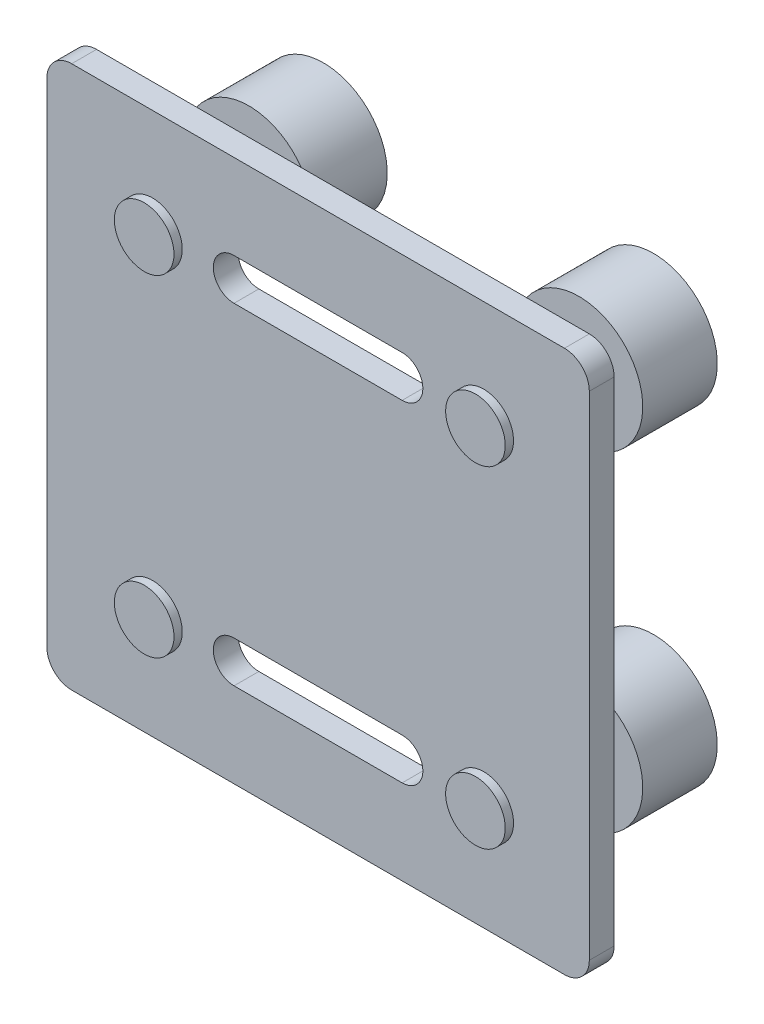
ISO-10303-21;
HEADER;
FILE_DESCRIPTION(('STEP AP214'),'2;1');
FILE_NAME('part.step','',(''),(''),'','','');
FILE_SCHEMA(('AUTOMOTIVE_DESIGN { 1 0 10303 214 1 1 1 1 }'));
ENDSEC;
DATA;
#1=APPLICATION_CONTEXT('core data for automotive mechanical design processes');
#2=APPLICATION_PROTOCOL_DEFINITION('international standard','automotive_design',2000,#1);
#3=PRODUCT_CONTEXT('',#1,'mechanical');
#4=PRODUCT('Part','Part','',(#3));
#5=PRODUCT_RELATED_PRODUCT_CATEGORY('part','',(#4));
#6=PRODUCT_DEFINITION_FORMATION('','',#4);
#7=PRODUCT_DEFINITION_CONTEXT('part definition',#1,'design');
#8=PRODUCT_DEFINITION('design','',#6,#7);
#9=PRODUCT_DEFINITION_SHAPE('','',#8);
#10=(LENGTH_UNIT() NAMED_UNIT(*) SI_UNIT(.MILLI.,.METRE.));
#11=(NAMED_UNIT(*) PLANE_ANGLE_UNIT() SI_UNIT($,.RADIAN.));
#12=(NAMED_UNIT(*) SI_UNIT($,.STERADIAN.) SOLID_ANGLE_UNIT());
#13=UNCERTAINTY_MEASURE_WITH_UNIT(LENGTH_MEASURE(1.E-05),#10,'distance_accuracy_value','');
#14=(GEOMETRIC_REPRESENTATION_CONTEXT(3) GLOBAL_UNCERTAINTY_ASSIGNED_CONTEXT((#13)) GLOBAL_UNIT_ASSIGNED_CONTEXT((#10,
#11,#12)) REPRESENTATION_CONTEXT('',''));
#15=CARTESIAN_POINT('',(0.,0.,0.));
#16=DIRECTION('',(0.,0.,1.));
#17=DIRECTION('',(1.,0.,0.));
#18=AXIS2_PLACEMENT_3D('',#15,#16,#17);
#19=CARTESIAN_POINT('',(0.,0.,3.));
#20=DIRECTION('',(0.,0.,1.));
#21=DIRECTION('',(1.,0.,0.));
#22=AXIS2_PLACEMENT_3D('',#19,#20,#21);
#23=PLANE('',#22);
#24=DIRECTION('',(-1.,0.,0.));
#25=VECTOR('',#24,1.);
#26=CARTESIAN_POINT('',(-10.15,-17.5,3.));
#27=LINE('',#26,#25);
#28=CARTESIAN_POINT('',(10.15,-17.5,3.));
#29=VERTEX_POINT('',#28);
#30=CARTESIAN_POINT('',(-10.15,-17.5,3.));
#31=VERTEX_POINT('',#30);
#32=EDGE_CURVE('E164',#29,#31,#27,.T.);
#33=ORIENTED_EDGE('',*,*,#32,.F.);
#34=CARTESIAN_POINT('',(10.15,-20.,3.));
#35=DIRECTION('',(0.,0.,1.));
#36=DIRECTION('',(1.,0.,0.));
#37=AXIS2_PLACEMENT_3D('',#34,#35,#36);
#38=CIRCLE('',#37,2.5);
#39=CARTESIAN_POINT('',(10.15,-22.5,3.));
#40=VERTEX_POINT('',#39);
#41=EDGE_CURVE('E154',#40,#29,#38,.T.);
#42=ORIENTED_EDGE('',*,*,#41,.F.);
#43=DIRECTION('',(1.,0.,0.));
#44=VECTOR('',#43,1.);
#45=CARTESIAN_POINT('',(-10.15,-22.5,3.));
#46=LINE('',#45,#44);
#47=CARTESIAN_POINT('',(-10.15,-22.5,3.));
#48=VERTEX_POINT('',#47);
#49=EDGE_CURVE('E180',#48,#40,#46,.T.);
#50=ORIENTED_EDGE('',*,*,#49,.F.);
#51=CARTESIAN_POINT('',(-10.15,-20.,3.));
#52=DIRECTION('',(0.,0.,1.));
#53=DIRECTION('',(-1.,0.,0.));
#54=AXIS2_PLACEMENT_3D('',#51,#52,#53);
#55=CIRCLE('',#54,2.5);
#56=EDGE_CURVE('E178',#31,#48,#55,.T.);
#57=ORIENTED_EDGE('',*,*,#56,.F.);
#58=EDGE_LOOP('',(#33,#42,#50,#57));
#59=FACE_BOUND('',#58,.T.);
#60=CARTESIAN_POINT('',(20.,-20.,3.));
#61=DIRECTION('',(0.,0.,1.));
#62=DIRECTION('',(1.,0.,0.));
#63=AXIS2_PLACEMENT_3D('',#60,#61,#62);
#64=CIRCLE('',#63,3.6);
#65=CARTESIAN_POINT('',(23.6,-20.,3.));
#66=VERTEX_POINT('',#65);
#67=EDGE_CURVE('E172',#66,#66,#64,.T.);
#68=ORIENTED_EDGE('',*,*,#67,.F.);
#69=EDGE_LOOP('',(#68));
#70=FACE_BOUND('',#69,.T.);
#71=CARTESIAN_POINT('',(-20.,20.,3.));
#72=DIRECTION('',(0.,0.,1.));
#73=DIRECTION('',(1.,0.,0.));
#74=AXIS2_PLACEMENT_3D('',#71,#72,#73);
#75=CIRCLE('',#74,3.6);
#76=CARTESIAN_POINT('',(-16.4,20.,3.));
#77=VERTEX_POINT('',#76);
#78=EDGE_CURVE('E234',#77,#77,#75,.T.);
#79=ORIENTED_EDGE('',*,*,#78,.F.);
#80=EDGE_LOOP('',(#79));
#81=FACE_BOUND('',#80,.T.);
#82=DIRECTION('',(0.,-1.,0.));
#83=VECTOR('',#82,1.);
#84=CARTESIAN_POINT('',(-32.75,-32.75,3.));
#85=LINE('',#84,#83);
#86=CARTESIAN_POINT('',(-32.75,29.75,3.));
#87=VERTEX_POINT('',#86);
#88=CARTESIAN_POINT('',(-32.75,-29.75,3.));
#89=VERTEX_POINT('',#88);
#90=EDGE_CURVE('E238',#87,#89,#85,.T.);
#91=ORIENTED_EDGE('',*,*,#90,.T.);
#92=CARTESIAN_POINT('',(-29.75,-29.75,3.));
#93=DIRECTION('',(0.,0.,1.));
#94=DIRECTION('',(1.,0.,0.));
#95=AXIS2_PLACEMENT_3D('',#92,#93,#94);
#96=CIRCLE('',#95,3.);
#97=CARTESIAN_POINT('',(-29.75,-32.75,3.));
#98=VERTEX_POINT('',#97);
#99=EDGE_CURVE('E281',#89,#98,#96,.T.);
#100=ORIENTED_EDGE('',*,*,#99,.T.);
#101=DIRECTION('',(1.,0.,0.));
#102=VECTOR('',#101,1.);
#103=CARTESIAN_POINT('',(32.75,-32.75,3.));
#104=LINE('',#103,#102);
#105=CARTESIAN_POINT('',(29.75,-32.75,3.));
#106=VERTEX_POINT('',#105);
#107=EDGE_CURVE('E241',#98,#106,#104,.T.);
#108=ORIENTED_EDGE('',*,*,#107,.T.);
#109=CARTESIAN_POINT('',(29.75,-29.75,3.));
#110=DIRECTION('',(0.,0.,1.));
#111=DIRECTION('',(1.,0.,0.));
#112=AXIS2_PLACEMENT_3D('',#109,#110,#111);
#113=CIRCLE('',#112,3.);
#114=CARTESIAN_POINT('',(32.75,-29.75,3.));
#115=VERTEX_POINT('',#114);
#116=EDGE_CURVE('E279',#106,#115,#113,.T.);
#117=ORIENTED_EDGE('',*,*,#116,.T.);
#118=DIRECTION('',(0.,1.,0.));
#119=VECTOR('',#118,1.);
#120=CARTESIAN_POINT('',(32.75,-32.75,3.));
#121=LINE('',#120,#119);
#122=CARTESIAN_POINT('',(32.75,29.75,3.));
#123=VERTEX_POINT('',#122);
#124=EDGE_CURVE('E245',#115,#123,#121,.T.);
#125=ORIENTED_EDGE('',*,*,#124,.T.);
#126=CARTESIAN_POINT('',(29.75,29.75,3.));
#127=DIRECTION('',(0.,0.,1.));
#128=DIRECTION('',(1.,0.,0.));
#129=AXIS2_PLACEMENT_3D('',#126,#127,#128);
#130=CIRCLE('',#129,3.);
#131=CARTESIAN_POINT('',(29.75,32.75,3.));
#132=VERTEX_POINT('',#131);
#133=EDGE_CURVE('E60',#123,#132,#130,.T.);
#134=ORIENTED_EDGE('',*,*,#133,.T.);
#135=DIRECTION('',(-1.,0.,0.));
#136=VECTOR('',#135,1.);
#137=CARTESIAN_POINT('',(32.75,32.75,3.));
#138=LINE('',#137,#136);
#139=CARTESIAN_POINT('',(-29.75,32.75,3.));
#140=VERTEX_POINT('',#139);
#141=EDGE_CURVE('E247',#132,#140,#138,.T.);
#142=ORIENTED_EDGE('',*,*,#141,.T.);
#143=CARTESIAN_POINT('',(-29.75,29.75,3.));
#144=DIRECTION('',(0.,0.,1.));
#145=DIRECTION('',(1.,0.,0.));
#146=AXIS2_PLACEMENT_3D('',#143,#144,#145);
#147=CIRCLE('',#146,3.);
#148=EDGE_CURVE('E276',#140,#87,#147,.T.);
#149=ORIENTED_EDGE('',*,*,#148,.T.);
#150=EDGE_LOOP('',(#91,#100,#108,#117,#125,#134,#142,#149));
#151=FACE_BOUND('',#150,.T.);
#152=CARTESIAN_POINT('',(20.,20.,3.));
#153=DIRECTION('',(0.,0.,1.));
#154=DIRECTION('',(-1.,0.,0.));
#155=AXIS2_PLACEMENT_3D('',#152,#153,#154);
#156=CIRCLE('',#155,3.6);
#157=CARTESIAN_POINT('',(16.4,20.,3.));
#158=VERTEX_POINT('',#157);
#159=EDGE_CURVE('E231',#158,#158,#156,.T.);
#160=ORIENTED_EDGE('',*,*,#159,.F.);
#161=EDGE_LOOP('',(#160));
#162=FACE_BOUND('',#161,.T.);
#163=DIRECTION('',(-1.,0.,0.));
#164=VECTOR('',#163,1.);
#165=CARTESIAN_POINT('',(-10.15,22.5,3.));
#166=LINE('',#165,#164);
#167=CARTESIAN_POINT('',(10.15,22.5,3.));
#168=VERTEX_POINT('',#167);
#169=CARTESIAN_POINT('',(-10.15,22.5,3.));
#170=VERTEX_POINT('',#169);
#171=EDGE_CURVE('E203',#168,#170,#166,.T.);
#172=ORIENTED_EDGE('',*,*,#171,.F.);
#173=CARTESIAN_POINT('',(10.15,20.,3.));
#174=DIRECTION('',(0.,0.,1.));
#175=DIRECTION('',(-1.,0.,0.));
#176=AXIS2_PLACEMENT_3D('',#173,#174,#175);
#177=CIRCLE('',#176,2.5);
#178=CARTESIAN_POINT('',(10.15,17.5,3.));
#179=VERTEX_POINT('',#178);
#180=EDGE_CURVE('E201',#179,#168,#177,.T.);
#181=ORIENTED_EDGE('',*,*,#180,.F.);
#182=DIRECTION('',(1.,0.,0.));
#183=VECTOR('',#182,1.);
#184=CARTESIAN_POINT('',(-10.15,17.5,3.));
#185=LINE('',#184,#183);
#186=CARTESIAN_POINT('',(-10.15,17.5,3.));
#187=VERTEX_POINT('',#186);
#188=EDGE_CURVE('E209',#187,#179,#185,.T.);
#189=ORIENTED_EDGE('',*,*,#188,.F.);
#190=CARTESIAN_POINT('',(-10.15,20.,3.));
#191=DIRECTION('',(0.,0.,1.));
#192=DIRECTION('',(1.,0.,0.));
#193=AXIS2_PLACEMENT_3D('',#190,#191,#192);
#194=CIRCLE('',#193,2.5);
#195=EDGE_CURVE('E206',#170,#187,#194,.T.);
#196=ORIENTED_EDGE('',*,*,#195,.F.);
#197=EDGE_LOOP('',(#172,#181,#189,#196));
#198=FACE_BOUND('',#197,.T.);
#199=CARTESIAN_POINT('',(-20.,-20.,3.));
#200=DIRECTION('',(0.,0.,1.));
#201=DIRECTION('',(-1.,0.,0.));
#202=AXIS2_PLACEMENT_3D('',#199,#200,#201);
#203=CIRCLE('',#202,3.6);
#204=CARTESIAN_POINT('',(-23.6,-20.,3.));
#205=VERTEX_POINT('',#204);
#206=EDGE_CURVE('E187',#205,#205,#203,.T.);
#207=ORIENTED_EDGE('',*,*,#206,.F.);
#208=EDGE_LOOP('',(#207));
#209=FACE_BOUND('',#208,.T.);
#210=ADVANCED_FACE('F39',(#59,#70,#81,#151,#162,#198,#209),#23,.T.);
#211=CARTESIAN_POINT('',(0.,0.,0.));
#212=DIRECTION('',(0.,0.,1.));
#213=DIRECTION('',(1.,0.,0.));
#214=AXIS2_PLACEMENT_3D('',#211,#212,#213);
#215=PLANE('',#214);
#216=CARTESIAN_POINT('',(20.,-20.,0.));
#217=DIRECTION('',(0.,0.,1.));
#218=DIRECTION('',(1.,0.,0.));
#219=AXIS2_PLACEMENT_3D('',#216,#217,#218);
#220=CIRCLE('',#219,3.6);
#221=CARTESIAN_POINT('',(23.6,-20.,0.));
#222=VERTEX_POINT('',#221);
#223=EDGE_CURVE('E836',#222,#222,#220,.F.);
#224=ORIENTED_EDGE('',*,*,#223,.F.);
#225=EDGE_LOOP('',(#224));
#226=FACE_BOUND('',#225,.T.);
#227=CARTESIAN_POINT('',(10.15,20.,0.));
#228=DIRECTION('',(0.,0.,1.));
#229=DIRECTION('',(-1.,0.,0.));
#230=AXIS2_PLACEMENT_3D('',#227,#228,#229);
#231=CIRCLE('',#230,2.5);
#232=CARTESIAN_POINT('',(10.15,17.5,0.));
#233=VERTEX_POINT('',#232);
#234=CARTESIAN_POINT('',(10.15,22.5,0.));
#235=VERTEX_POINT('',#234);
#236=EDGE_CURVE('E200',#233,#235,#231,.T.);
#237=ORIENTED_EDGE('',*,*,#236,.T.);
#238=DIRECTION('',(-1.,0.,0.));
#239=VECTOR('',#238,1.);
#240=CARTESIAN_POINT('',(-10.15,22.5,0.));
#241=LINE('',#240,#239);
#242=CARTESIAN_POINT('',(-10.15,22.5,0.));
#243=VERTEX_POINT('',#242);
#244=EDGE_CURVE('E214',#235,#243,#241,.T.);
#245=ORIENTED_EDGE('',*,*,#244,.T.);
#246=CARTESIAN_POINT('',(-10.15,20.,0.));
#247=DIRECTION('',(0.,0.,1.));
#248=DIRECTION('',(1.,0.,0.));
#249=AXIS2_PLACEMENT_3D('',#246,#247,#248);
#250=CIRCLE('',#249,2.5);
#251=CARTESIAN_POINT('',(-10.15,17.5,0.));
#252=VERTEX_POINT('',#251);
#253=EDGE_CURVE('E217',#243,#252,#250,.T.);
#254=ORIENTED_EDGE('',*,*,#253,.T.);
#255=DIRECTION('',(1.,0.,0.));
#256=VECTOR('',#255,1.);
#257=CARTESIAN_POINT('',(-10.15,17.5,0.));
#258=LINE('',#257,#256);
#259=EDGE_CURVE('E204',#252,#233,#258,.T.);
#260=ORIENTED_EDGE('',*,*,#259,.T.);
#261=EDGE_LOOP('',(#237,#245,#254,#260));
#262=FACE_BOUND('',#261,.T.);
#263=DIRECTION('',(1.,0.,0.));
#264=VECTOR('',#263,1.);
#265=CARTESIAN_POINT('',(32.75,-32.75,0.));
#266=LINE('',#265,#264);
#267=CARTESIAN_POINT('',(-29.75,-32.75,0.));
#268=VERTEX_POINT('',#267);
#269=CARTESIAN_POINT('',(29.75,-32.75,0.));
#270=VERTEX_POINT('',#269);
#271=EDGE_CURVE('E252',#268,#270,#266,.T.);
#272=ORIENTED_EDGE('',*,*,#271,.F.);
#273=CARTESIAN_POINT('',(-29.75,-29.75,0.));
#274=DIRECTION('',(0.,0.,1.));
#275=DIRECTION('',(1.,0.,0.));
#276=AXIS2_PLACEMENT_3D('',#273,#274,#275);
#277=CIRCLE('',#276,3.);
#278=CARTESIAN_POINT('',(-32.75,-29.75,0.));
#279=VERTEX_POINT('',#278);
#280=EDGE_CURVE('E269',#268,#279,#277,.F.);
#281=ORIENTED_EDGE('',*,*,#280,.T.);
#282=DIRECTION('',(0.,-1.,0.));
#283=VECTOR('',#282,1.);
#284=CARTESIAN_POINT('',(-32.75,-32.75,0.));
#285=LINE('',#284,#283);
#286=CARTESIAN_POINT('',(-32.75,29.75,0.));
#287=VERTEX_POINT('',#286);
#288=EDGE_CURVE('E237',#287,#279,#285,.T.);
#289=ORIENTED_EDGE('',*,*,#288,.F.);
#290=CARTESIAN_POINT('',(-29.75,29.75,0.));
#291=DIRECTION('',(0.,0.,1.));
#292=DIRECTION('',(1.,0.,0.));
#293=AXIS2_PLACEMENT_3D('',#290,#291,#292);
#294=CIRCLE('',#293,3.);
#295=CARTESIAN_POINT('',(-29.75,32.75,0.));
#296=VERTEX_POINT('',#295);
#297=EDGE_CURVE('E263',#287,#296,#294,.F.);
#298=ORIENTED_EDGE('',*,*,#297,.T.);
#299=DIRECTION('',(-1.,0.,0.));
#300=VECTOR('',#299,1.);
#301=CARTESIAN_POINT('',(32.75,32.75,0.));
#302=LINE('',#301,#300);
#303=CARTESIAN_POINT('',(29.75,32.75,0.));
#304=VERTEX_POINT('',#303);
#305=EDGE_CURVE('E242',#304,#296,#302,.T.);
#306=ORIENTED_EDGE('',*,*,#305,.F.);
#307=CARTESIAN_POINT('',(29.75,29.75,0.));
#308=DIRECTION('',(0.,0.,1.));
#309=DIRECTION('',(1.,0.,0.));
#310=AXIS2_PLACEMENT_3D('',#307,#308,#309);
#311=CIRCLE('',#310,3.);
#312=CARTESIAN_POINT('',(32.75,29.75,0.));
#313=VERTEX_POINT('',#312);
#314=EDGE_CURVE('E265',#304,#313,#311,.F.);
#315=ORIENTED_EDGE('',*,*,#314,.T.);
#316=DIRECTION('',(0.,1.,0.));
#317=VECTOR('',#316,1.);
#318=CARTESIAN_POINT('',(32.75,-32.75,0.));
#319=LINE('',#318,#317);
#320=CARTESIAN_POINT('',(32.75,-29.75,0.));
#321=VERTEX_POINT('',#320);
#322=EDGE_CURVE('E255',#321,#313,#319,.T.);
#323=ORIENTED_EDGE('',*,*,#322,.F.);
#324=CARTESIAN_POINT('',(29.75,-29.75,0.));
#325=DIRECTION('',(0.,0.,1.));
#326=DIRECTION('',(1.,0.,0.));
#327=AXIS2_PLACEMENT_3D('',#324,#325,#326);
#328=CIRCLE('',#327,3.);
#329=EDGE_CURVE('E267',#321,#270,#328,.F.);
#330=ORIENTED_EDGE('',*,*,#329,.T.);
#331=EDGE_LOOP('',(#272,#281,#289,#298,#306,#315,#323,#330));
#332=FACE_BOUND('',#331,.T.);
#333=CARTESIAN_POINT('',(-20.,20.,0.));
#334=DIRECTION('',(0.,0.,1.));
#335=DIRECTION('',(1.,0.,0.));
#336=AXIS2_PLACEMENT_3D('',#333,#334,#335);
#337=CIRCLE('',#336,3.6);
#338=CARTESIAN_POINT('',(-16.4,20.,0.));
#339=VERTEX_POINT('',#338);
#340=EDGE_CURVE('E859',#339,#339,#337,.F.);
#341=ORIENTED_EDGE('',*,*,#340,.F.);
#342=EDGE_LOOP('',(#341));
#343=FACE_BOUND('',#342,.T.);
#344=CARTESIAN_POINT('',(20.,20.,0.));
#345=DIRECTION('',(0.,0.,1.));
#346=DIRECTION('',(1.,0.,0.));
#347=AXIS2_PLACEMENT_3D('',#344,#345,#346);
#348=CIRCLE('',#347,3.6);
#349=CARTESIAN_POINT('',(23.6,20.,0.));
#350=VERTEX_POINT('',#349);
#351=EDGE_CURVE('E844',#350,#350,#348,.F.);
#352=ORIENTED_EDGE('',*,*,#351,.F.);
#353=EDGE_LOOP('',(#352));
#354=FACE_BOUND('',#353,.T.);
#355=CARTESIAN_POINT('',(10.15,-20.,0.));
#356=DIRECTION('',(0.,0.,1.));
#357=DIRECTION('',(1.,0.,0.));
#358=AXIS2_PLACEMENT_3D('',#355,#356,#357);
#359=CIRCLE('',#358,2.5);
#360=CARTESIAN_POINT('',(10.15,-22.5,0.));
#361=VERTEX_POINT('',#360);
#362=CARTESIAN_POINT('',(10.15,-17.5,0.));
#363=VERTEX_POINT('',#362);
#364=EDGE_CURVE('E185',#361,#363,#359,.T.);
#365=ORIENTED_EDGE('',*,*,#364,.T.);
#366=DIRECTION('',(-1.,0.,0.));
#367=VECTOR('',#366,1.);
#368=CARTESIAN_POINT('',(-10.15,-17.5,0.));
#369=LINE('',#368,#367);
#370=CARTESIAN_POINT('',(-10.15,-17.5,0.));
#371=VERTEX_POINT('',#370);
#372=EDGE_CURVE('E171',#363,#371,#369,.T.);
#373=ORIENTED_EDGE('',*,*,#372,.T.);
#374=CARTESIAN_POINT('',(-10.15,-20.,0.));
#375=DIRECTION('',(0.,0.,1.));
#376=DIRECTION('',(-1.,0.,0.));
#377=AXIS2_PLACEMENT_3D('',#374,#375,#376);
#378=CIRCLE('',#377,2.5);
#379=CARTESIAN_POINT('',(-10.15,-22.5,0.));
#380=VERTEX_POINT('',#379);
#381=EDGE_CURVE('E189',#371,#380,#378,.T.);
#382=ORIENTED_EDGE('',*,*,#381,.T.);
#383=DIRECTION('',(1.,0.,0.));
#384=VECTOR('',#383,1.);
#385=CARTESIAN_POINT('',(-10.15,-22.5,0.));
#386=LINE('',#385,#384);
#387=EDGE_CURVE('E165',#380,#361,#386,.T.);
#388=ORIENTED_EDGE('',*,*,#387,.T.);
#389=EDGE_LOOP('',(#365,#373,#382,#388));
#390=FACE_BOUND('',#389,.T.);
#391=CARTESIAN_POINT('',(-20.,-20.,0.));
#392=DIRECTION('',(0.,0.,1.));
#393=DIRECTION('',(1.,0.,0.));
#394=AXIS2_PLACEMENT_3D('',#391,#392,#393);
#395=CIRCLE('',#394,3.6);
#396=CARTESIAN_POINT('',(-16.4,-20.,0.));
#397=VERTEX_POINT('',#396);
#398=EDGE_CURVE('E851',#397,#397,#395,.F.);
#399=ORIENTED_EDGE('',*,*,#398,.F.);
#400=EDGE_LOOP('',(#399));
#401=FACE_BOUND('',#400,.T.);
#402=ADVANCED_FACE('F297',(#226,#262,#332,#343,#354,#390,#401),#215,.F.);
#403=CARTESIAN_POINT('',(-32.75,-32.75,3.));
#404=DIRECTION('',(1.,0.,0.));
#405=DIRECTION('',(0.,0.,-1.));
#406=AXIS2_PLACEMENT_3D('',#403,#404,#405);
#407=PLANE('',#406);
#408=ORIENTED_EDGE('',*,*,#288,.T.);
#409=DIRECTION('',(0.,0.,-1.));
#410=VECTOR('',#409,1.);
#411=CARTESIAN_POINT('',(-32.75,-29.75,3.));
#412=LINE('',#411,#410);
#413=EDGE_CURVE('E274',#279,#89,#412,.F.);
#414=ORIENTED_EDGE('',*,*,#413,.T.);
#415=ORIENTED_EDGE('',*,*,#90,.F.);
#416=DIRECTION('',(0.,0.,-1.));
#417=VECTOR('',#416,1.);
#418=CARTESIAN_POINT('',(-32.75,29.75,3.));
#419=LINE('',#418,#417);
#420=EDGE_CURVE('E271',#87,#287,#419,.T.);
#421=ORIENTED_EDGE('',*,*,#420,.T.);
#422=EDGE_LOOP('',(#408,#414,#415,#421));
#423=FACE_BOUND('',#422,.T.);
#424=ADVANCED_FACE('F311',(#423),#407,.F.);
#425=CARTESIAN_POINT('',(32.75,-32.75,3.));
#426=DIRECTION('',(0.,1.,0.));
#427=DIRECTION('',(-1.,0.,0.));
#428=AXIS2_PLACEMENT_3D('',#425,#426,#427);
#429=PLANE('',#428);
#430=ORIENTED_EDGE('',*,*,#107,.F.);
#431=DIRECTION('',(0.,0.,-1.));
#432=VECTOR('',#431,1.);
#433=CARTESIAN_POINT('',(-29.75,-32.75,3.));
#434=LINE('',#433,#432);
#435=EDGE_CURVE('E260',#98,#268,#434,.T.);
#436=ORIENTED_EDGE('',*,*,#435,.T.);
#437=ORIENTED_EDGE('',*,*,#271,.T.);
#438=DIRECTION('',(0.,0.,-1.));
#439=VECTOR('',#438,1.);
#440=CARTESIAN_POINT('',(29.75,-32.75,3.));
#441=LINE('',#440,#439);
#442=EDGE_CURVE('E249',#270,#106,#441,.F.);
#443=ORIENTED_EDGE('',*,*,#442,.T.);
#444=EDGE_LOOP('',(#430,#436,#437,#443));
#445=FACE_BOUND('',#444,.T.);
#446=ADVANCED_FACE('F319',(#445),#429,.F.);
#447=CARTESIAN_POINT('',(32.75,-32.75,3.));
#448=DIRECTION('',(-1.,0.,0.));
#449=DIRECTION('',(0.,0.,1.));
#450=AXIS2_PLACEMENT_3D('',#447,#448,#449);
#451=PLANE('',#450);
#452=ORIENTED_EDGE('',*,*,#124,.F.);
#453=DIRECTION('',(0.,0.,-1.));
#454=VECTOR('',#453,1.);
#455=CARTESIAN_POINT('',(32.75,-29.75,3.));
#456=LINE('',#455,#454);
#457=EDGE_CURVE('E285',#115,#321,#456,.T.);
#458=ORIENTED_EDGE('',*,*,#457,.T.);
#459=ORIENTED_EDGE('',*,*,#322,.T.);
#460=DIRECTION('',(0.,0.,-1.));
#461=VECTOR('',#460,1.);
#462=CARTESIAN_POINT('',(32.75,29.75,3.));
#463=LINE('',#462,#461);
#464=EDGE_CURVE('E283',#313,#123,#463,.F.);
#465=ORIENTED_EDGE('',*,*,#464,.T.);
#466=EDGE_LOOP('',(#452,#458,#459,#465));
#467=FACE_BOUND('',#466,.T.);
#468=ADVANCED_FACE('F291',(#467),#451,.F.);
#469=CARTESIAN_POINT('',(32.75,32.75,3.));
#470=DIRECTION('',(0.,-1.,0.));
#471=DIRECTION('',(1.,0.,0.));
#472=AXIS2_PLACEMENT_3D('',#469,#470,#471);
#473=PLANE('',#472);
#474=ORIENTED_EDGE('',*,*,#141,.F.);
#475=DIRECTION('',(0.,0.,-1.));
#476=VECTOR('',#475,1.);
#477=CARTESIAN_POINT('',(29.75,32.75,3.));
#478=LINE('',#477,#476);
#479=EDGE_CURVE('E11',#132,#304,#478,.T.);
#480=ORIENTED_EDGE('',*,*,#479,.T.);
#481=ORIENTED_EDGE('',*,*,#305,.T.);
#482=DIRECTION('',(0.,0.,-1.));
#483=VECTOR('',#482,1.);
#484=CARTESIAN_POINT('',(-29.75,32.75,3.));
#485=LINE('',#484,#483);
#486=EDGE_CURVE('E47',#296,#140,#485,.F.);
#487=ORIENTED_EDGE('',*,*,#486,.T.);
#488=EDGE_LOOP('',(#474,#480,#481,#487));
#489=FACE_BOUND('',#488,.T.);
#490=ADVANCED_FACE('F303',(#489),#473,.F.);
#491=CARTESIAN_POINT('',(10.15,20.,3.));
#492=DIRECTION('',(0.,0.,-1.));
#493=DIRECTION('',(-1.,0.,0.));
#494=AXIS2_PLACEMENT_3D('',#491,#492,#493);
#495=CYLINDRICAL_SURFACE('',#494,2.5);
#496=ORIENTED_EDGE('',*,*,#236,.F.);
#497=DIRECTION('',(0.,0.,-1.));
#498=VECTOR('',#497,1.);
#499=CARTESIAN_POINT('',(10.15,17.5,3.));
#500=LINE('',#499,#498);
#501=EDGE_CURVE('E211',#179,#233,#500,.T.);
#502=ORIENTED_EDGE('',*,*,#501,.F.);
#503=ORIENTED_EDGE('',*,*,#180,.T.);
#504=DIRECTION('',(0.,0.,-1.));
#505=VECTOR('',#504,1.);
#506=CARTESIAN_POINT('',(10.15,22.5,3.));
#507=LINE('',#506,#505);
#508=EDGE_CURVE('E228',#168,#235,#507,.T.);
#509=ORIENTED_EDGE('',*,*,#508,.T.);
#510=EDGE_LOOP('',(#496,#502,#503,#509));
#511=FACE_BOUND('',#510,.T.);
#512=ADVANCED_FACE('F338',(#511),#495,.F.);
#513=CARTESIAN_POINT('',(-10.15,22.5,3.));
#514=DIRECTION('',(0.,-1.,0.));
#515=DIRECTION('',(0.,0.,-1.));
#516=AXIS2_PLACEMENT_3D('',#513,#514,#515);
#517=PLANE('',#516);
#518=ORIENTED_EDGE('',*,*,#244,.F.);
#519=ORIENTED_EDGE('',*,*,#508,.F.);
#520=ORIENTED_EDGE('',*,*,#171,.T.);
#521=DIRECTION('',(0.,0.,-1.));
#522=VECTOR('',#521,1.);
#523=CARTESIAN_POINT('',(-10.15,22.5,3.));
#524=LINE('',#523,#522);
#525=EDGE_CURVE('E226',#170,#243,#524,.T.);
#526=ORIENTED_EDGE('',*,*,#525,.T.);
#527=EDGE_LOOP('',(#518,#519,#520,#526));
#528=FACE_BOUND('',#527,.T.);
#529=ADVANCED_FACE('F371',(#528),#517,.T.);
#530=CARTESIAN_POINT('',(-10.15,20.,3.));
#531=DIRECTION('',(0.,0.,-1.));
#532=DIRECTION('',(-1.,0.,0.));
#533=AXIS2_PLACEMENT_3D('',#530,#531,#532);
#534=CYLINDRICAL_SURFACE('',#533,2.5);
#535=ORIENTED_EDGE('',*,*,#253,.F.);
#536=ORIENTED_EDGE('',*,*,#525,.F.);
#537=ORIENTED_EDGE('',*,*,#195,.T.);
#538=DIRECTION('',(0.,0.,-1.));
#539=VECTOR('',#538,1.);
#540=CARTESIAN_POINT('',(-10.15,17.5,3.));
#541=LINE('',#540,#539);
#542=EDGE_CURVE('E224',#187,#252,#541,.T.);
#543=ORIENTED_EDGE('',*,*,#542,.T.);
#544=EDGE_LOOP('',(#535,#536,#537,#543));
#545=FACE_BOUND('',#544,.T.);
#546=ADVANCED_FACE('F378',(#545),#534,.F.);
#547=CARTESIAN_POINT('',(-10.15,17.5,3.));
#548=DIRECTION('',(0.,1.,0.));
#549=DIRECTION('',(0.,0.,1.));
#550=AXIS2_PLACEMENT_3D('',#547,#548,#549);
#551=PLANE('',#550);
#552=ORIENTED_EDGE('',*,*,#259,.F.);
#553=ORIENTED_EDGE('',*,*,#542,.F.);
#554=ORIENTED_EDGE('',*,*,#188,.T.);
#555=ORIENTED_EDGE('',*,*,#501,.T.);
#556=EDGE_LOOP('',(#552,#553,#554,#555));
#557=FACE_BOUND('',#556,.T.);
#558=ADVANCED_FACE('F385',(#557),#551,.T.);
#559=CARTESIAN_POINT('',(10.15,-20.,3.));
#560=DIRECTION('',(0.,0.,-1.));
#561=DIRECTION('',(-1.,0.,0.));
#562=AXIS2_PLACEMENT_3D('',#559,#560,#561);
#563=CYLINDRICAL_SURFACE('',#562,2.5);
#564=ORIENTED_EDGE('',*,*,#364,.F.);
#565=DIRECTION('',(0.,0.,-1.));
#566=VECTOR('',#565,1.);
#567=CARTESIAN_POINT('',(10.15,-22.5,3.));
#568=LINE('',#567,#566);
#569=EDGE_CURVE('E160',#40,#361,#568,.T.);
#570=ORIENTED_EDGE('',*,*,#569,.F.);
#571=ORIENTED_EDGE('',*,*,#41,.T.);
#572=DIRECTION('',(0.,0.,-1.));
#573=VECTOR('',#572,1.);
#574=CARTESIAN_POINT('',(10.15,-17.5,3.));
#575=LINE('',#574,#573);
#576=EDGE_CURVE('E157',#29,#363,#575,.T.);
#577=ORIENTED_EDGE('',*,*,#576,.T.);
#578=EDGE_LOOP('',(#564,#570,#571,#577));
#579=FACE_BOUND('',#578,.T.);
#580=ADVANCED_FACE('F156',(#579),#563,.F.);
#581=CARTESIAN_POINT('',(-10.15,-17.5,3.));
#582=DIRECTION('',(0.,-1.,0.));
#583=DIRECTION('',(0.,0.,-1.));
#584=AXIS2_PLACEMENT_3D('',#581,#582,#583);
#585=PLANE('',#584);
#586=ORIENTED_EDGE('',*,*,#372,.F.);
#587=ORIENTED_EDGE('',*,*,#576,.F.);
#588=ORIENTED_EDGE('',*,*,#32,.T.);
#589=DIRECTION('',(0.,0.,-1.));
#590=VECTOR('',#589,1.);
#591=CARTESIAN_POINT('',(-10.15,-17.5,3.));
#592=LINE('',#591,#590);
#593=EDGE_CURVE('E173',#31,#371,#592,.T.);
#594=ORIENTED_EDGE('',*,*,#593,.T.);
#595=EDGE_LOOP('',(#586,#587,#588,#594));
#596=FACE_BOUND('',#595,.T.);
#597=ADVANCED_FACE('F168',(#596),#585,.T.);
#598=CARTESIAN_POINT('',(-10.15,-20.,3.));
#599=DIRECTION('',(0.,0.,-1.));
#600=DIRECTION('',(-1.,0.,0.));
#601=AXIS2_PLACEMENT_3D('',#598,#599,#600);
#602=CYLINDRICAL_SURFACE('',#601,2.5);
#603=ORIENTED_EDGE('',*,*,#381,.F.);
#604=ORIENTED_EDGE('',*,*,#593,.F.);
#605=ORIENTED_EDGE('',*,*,#56,.T.);
#606=DIRECTION('',(0.,0.,-1.));
#607=VECTOR('',#606,1.);
#608=CARTESIAN_POINT('',(-10.15,-22.5,3.));
#609=LINE('',#608,#607);
#610=EDGE_CURVE('E195',#48,#380,#609,.T.);
#611=ORIENTED_EDGE('',*,*,#610,.T.);
#612=EDGE_LOOP('',(#603,#604,#605,#611));
#613=FACE_BOUND('',#612,.T.);
#614=ADVANCED_FACE('F406',(#613),#602,.F.);
#615=CARTESIAN_POINT('',(-10.15,-22.5,3.));
#616=DIRECTION('',(0.,1.,0.));
#617=DIRECTION('',(0.,0.,1.));
#618=AXIS2_PLACEMENT_3D('',#615,#616,#617);
#619=PLANE('',#618);
#620=ORIENTED_EDGE('',*,*,#387,.F.);
#621=ORIENTED_EDGE('',*,*,#610,.F.);
#622=ORIENTED_EDGE('',*,*,#49,.T.);
#623=ORIENTED_EDGE('',*,*,#569,.T.);
#624=EDGE_LOOP('',(#620,#621,#622,#623));
#625=FACE_BOUND('',#624,.T.);
#626=ADVANCED_FACE('F328',(#625),#619,.T.);
#627=CARTESIAN_POINT('',(-29.75,-29.75,3.));
#628=DIRECTION('',(0.,0.,-1.));
#629=DIRECTION('',(-1.,0.,0.));
#630=AXIS2_PLACEMENT_3D('',#627,#628,#629);
#631=CYLINDRICAL_SURFACE('',#630,3.);
#632=ORIENTED_EDGE('',*,*,#99,.F.);
#633=ORIENTED_EDGE('',*,*,#413,.F.);
#634=ORIENTED_EDGE('',*,*,#280,.F.);
#635=ORIENTED_EDGE('',*,*,#435,.F.);
#636=EDGE_LOOP('',(#632,#633,#634,#635));
#637=FACE_BOUND('',#636,.T.);
#638=ADVANCED_FACE('F316',(#637),#631,.T.);
#639=CARTESIAN_POINT('',(29.75,-29.75,3.));
#640=DIRECTION('',(0.,0.,-1.));
#641=DIRECTION('',(-1.,0.,0.));
#642=AXIS2_PLACEMENT_3D('',#639,#640,#641);
#643=CYLINDRICAL_SURFACE('',#642,3.);
#644=ORIENTED_EDGE('',*,*,#116,.F.);
#645=ORIENTED_EDGE('',*,*,#442,.F.);
#646=ORIENTED_EDGE('',*,*,#329,.F.);
#647=ORIENTED_EDGE('',*,*,#457,.F.);
#648=EDGE_LOOP('',(#644,#645,#646,#647));
#649=FACE_BOUND('',#648,.T.);
#650=ADVANCED_FACE('F321',(#649),#643,.T.);
#651=CARTESIAN_POINT('',(29.75,29.75,3.));
#652=DIRECTION('',(0.,0.,-1.));
#653=DIRECTION('',(-1.,0.,0.));
#654=AXIS2_PLACEMENT_3D('',#651,#652,#653);
#655=CYLINDRICAL_SURFACE('',#654,3.);
#656=ORIENTED_EDGE('',*,*,#133,.F.);
#657=ORIENTED_EDGE('',*,*,#464,.F.);
#658=ORIENTED_EDGE('',*,*,#314,.F.);
#659=ORIENTED_EDGE('',*,*,#479,.F.);
#660=EDGE_LOOP('',(#656,#657,#658,#659));
#661=FACE_BOUND('',#660,.T.);
#662=ADVANCED_FACE('F302',(#661),#655,.T.);
#663=CARTESIAN_POINT('',(-29.75,29.75,3.));
#664=DIRECTION('',(0.,0.,-1.));
#665=DIRECTION('',(-1.,0.,0.));
#666=AXIS2_PLACEMENT_3D('',#663,#664,#665);
#667=CYLINDRICAL_SURFACE('',#666,3.);
#668=ORIENTED_EDGE('',*,*,#148,.F.);
#669=ORIENTED_EDGE('',*,*,#486,.F.);
#670=ORIENTED_EDGE('',*,*,#297,.F.);
#671=ORIENTED_EDGE('',*,*,#420,.F.);
#672=EDGE_LOOP('',(#668,#669,#670,#671));
#673=FACE_BOUND('',#672,.T.);
#674=ADVANCED_FACE('F41',(#673),#667,.T.);
#675=CARTESIAN_POINT('',(-20.,20.,4.));
#676=DIRECTION('',(0.,0.,-1.));
#677=DIRECTION('',(-1.,0.,0.));
#678=AXIS2_PLACEMENT_3D('',#675,#676,#677);
#679=CYLINDRICAL_SURFACE('',#678,3.6);
#680=CARTESIAN_POINT('',(-20.,20.,-8.5));
#681=DIRECTION('',(0.,0.,1.));
#682=DIRECTION('',(1.,0.,0.));
#683=AXIS2_PLACEMENT_3D('',#680,#681,#682);
#684=CIRCLE('',#683,3.6);
#685=CARTESIAN_POINT('',(-16.4,20.,-8.5));
#686=VERTEX_POINT('',#685);
#687=EDGE_CURVE('E813',#686,#686,#684,.T.);
#688=ORIENTED_EDGE('',*,*,#687,.T.);
#689=EDGE_LOOP('',(#688));
#690=FACE_BOUND('',#689,.T.);
#691=ORIENTED_EDGE('',*,*,#340,.T.);
#692=EDGE_LOOP('',(#691));
#693=FACE_BOUND('',#692,.T.);
#694=ADVANCED_FACE('F446',(#690,#693),#679,.T.);
#695=ORIENTED_EDGE('',*,*,#78,.T.);
#696=EDGE_LOOP('',(#695));
#697=FACE_BOUND('',#696,.T.);
#698=CARTESIAN_POINT('',(-20.,20.,4.));
#699=DIRECTION('',(0.,0.,1.));
#700=DIRECTION('',(1.,0.,0.));
#701=AXIS2_PLACEMENT_3D('',#698,#699,#700);
#702=CIRCLE('',#701,3.6);
#703=CARTESIAN_POINT('',(-16.4,20.,4.));
#704=VERTEX_POINT('',#703);
#705=EDGE_CURVE('E854',#704,#704,#702,.T.);
#706=ORIENTED_EDGE('',*,*,#705,.F.);
#707=EDGE_LOOP('',(#706));
#708=FACE_BOUND('',#707,.T.);
#709=ADVANCED_FACE('F455',(#697,#708),#679,.T.);
#710=CARTESIAN_POINT('',(-20.,20.,4.));
#711=DIRECTION('',(0.,0.,1.));
#712=DIRECTION('',(1.,0.,0.));
#713=AXIS2_PLACEMENT_3D('',#710,#711,#712);
#714=PLANE('',#713);
#715=ORIENTED_EDGE('',*,*,#705,.T.);
#716=EDGE_LOOP('',(#715));
#717=FACE_BOUND('',#716,.T.);
#718=ADVANCED_FACE('F466',(#717),#714,.T.);
#719=CARTESIAN_POINT('',(-20.,-20.,4.));
#720=DIRECTION('',(0.,0.,-1.));
#721=DIRECTION('',(-1.,0.,0.));
#722=AXIS2_PLACEMENT_3D('',#719,#720,#721);
#723=CYLINDRICAL_SURFACE('',#722,3.6);
#724=CARTESIAN_POINT('',(-20.,-20.,-8.5));
#725=DIRECTION('',(0.,0.,1.));
#726=DIRECTION('',(1.,0.,0.));
#727=AXIS2_PLACEMENT_3D('',#724,#725,#726);
#728=CIRCLE('',#727,3.6);
#729=CARTESIAN_POINT('',(-16.4,-20.,-8.5));
#730=VERTEX_POINT('',#729);
#731=EDGE_CURVE('E800',#730,#730,#728,.T.);
#732=ORIENTED_EDGE('',*,*,#731,.T.);
#733=EDGE_LOOP('',(#732));
#734=FACE_BOUND('',#733,.T.);
#735=ORIENTED_EDGE('',*,*,#398,.T.);
#736=EDGE_LOOP('',(#735));
#737=FACE_BOUND('',#736,.T.);
#738=ADVANCED_FACE('F476',(#734,#737),#723,.T.);
#739=ORIENTED_EDGE('',*,*,#206,.T.);
#740=EDGE_LOOP('',(#739));
#741=FACE_BOUND('',#740,.T.);
#742=CARTESIAN_POINT('',(-20.,-20.,4.));
#743=DIRECTION('',(0.,0.,1.));
#744=DIRECTION('',(1.,0.,0.));
#745=AXIS2_PLACEMENT_3D('',#742,#743,#744);
#746=CIRCLE('',#745,3.6);
#747=CARTESIAN_POINT('',(-16.4,-20.,4.));
#748=VERTEX_POINT('',#747);
#749=EDGE_CURVE('E847',#748,#748,#746,.T.);
#750=ORIENTED_EDGE('',*,*,#749,.F.);
#751=EDGE_LOOP('',(#750));
#752=FACE_BOUND('',#751,.T.);
#753=ADVANCED_FACE('F487',(#741,#752),#723,.T.);
#754=CARTESIAN_POINT('',(-20.,-20.,4.));
#755=DIRECTION('',(0.,0.,1.));
#756=DIRECTION('',(1.,0.,0.));
#757=AXIS2_PLACEMENT_3D('',#754,#755,#756);
#758=PLANE('',#757);
#759=ORIENTED_EDGE('',*,*,#749,.T.);
#760=EDGE_LOOP('',(#759));
#761=FACE_BOUND('',#760,.T.);
#762=ADVANCED_FACE('F498',(#761),#758,.T.);
#763=CARTESIAN_POINT('',(20.,20.,4.));
#764=DIRECTION('',(0.,0.,-1.));
#765=DIRECTION('',(-1.,0.,0.));
#766=AXIS2_PLACEMENT_3D('',#763,#764,#765);
#767=CYLINDRICAL_SURFACE('',#766,3.6);
#768=CARTESIAN_POINT('',(20.,20.,-8.5));
#769=DIRECTION('',(0.,0.,1.));
#770=DIRECTION('',(1.,0.,0.));
#771=AXIS2_PLACEMENT_3D('',#768,#769,#770);
#772=CIRCLE('',#771,3.6);
#773=CARTESIAN_POINT('',(23.6,20.,-8.5));
#774=VERTEX_POINT('',#773);
#775=EDGE_CURVE('E820',#774,#774,#772,.T.);
#776=ORIENTED_EDGE('',*,*,#775,.T.);
#777=EDGE_LOOP('',(#776));
#778=FACE_BOUND('',#777,.T.);
#779=ORIENTED_EDGE('',*,*,#351,.T.);
#780=EDGE_LOOP('',(#779));
#781=FACE_BOUND('',#780,.T.);
#782=ADVANCED_FACE('F508',(#778,#781),#767,.T.);
#783=ORIENTED_EDGE('',*,*,#159,.T.);
#784=EDGE_LOOP('',(#783));
#785=FACE_BOUND('',#784,.T.);
#786=CARTESIAN_POINT('',(20.,20.,4.));
#787=DIRECTION('',(0.,0.,1.));
#788=DIRECTION('',(1.,0.,0.));
#789=AXIS2_PLACEMENT_3D('',#786,#787,#788);
#790=CIRCLE('',#789,3.6);
#791=CARTESIAN_POINT('',(23.6,20.,4.));
#792=VERTEX_POINT('',#791);
#793=EDGE_CURVE('E839',#792,#792,#790,.T.);
#794=ORIENTED_EDGE('',*,*,#793,.F.);
#795=EDGE_LOOP('',(#794));
#796=FACE_BOUND('',#795,.T.);
#797=ADVANCED_FACE('F519',(#785,#796),#767,.T.);
#798=CARTESIAN_POINT('',(20.,20.,4.));
#799=DIRECTION('',(0.,0.,1.));
#800=DIRECTION('',(1.,0.,0.));
#801=AXIS2_PLACEMENT_3D('',#798,#799,#800);
#802=PLANE('',#801);
#803=ORIENTED_EDGE('',*,*,#793,.T.);
#804=EDGE_LOOP('',(#803));
#805=FACE_BOUND('',#804,.T.);
#806=ADVANCED_FACE('F530',(#805),#802,.T.);
#807=CARTESIAN_POINT('',(20.,-20.,4.));
#808=DIRECTION('',(0.,0.,-1.));
#809=DIRECTION('',(-1.,0.,0.));
#810=AXIS2_PLACEMENT_3D('',#807,#808,#809);
#811=CYLINDRICAL_SURFACE('',#810,3.6);
#812=CARTESIAN_POINT('',(20.,-20.,-8.5));
#813=DIRECTION('',(0.,0.,1.));
#814=DIRECTION('',(1.,0.,0.));
#815=AXIS2_PLACEMENT_3D('',#812,#813,#814);
#816=CIRCLE('',#815,3.6);
#817=CARTESIAN_POINT('',(23.6,-20.,-8.5));
#818=VERTEX_POINT('',#817);
#819=EDGE_CURVE('E827',#818,#818,#816,.T.);
#820=ORIENTED_EDGE('',*,*,#819,.T.);
#821=EDGE_LOOP('',(#820));
#822=FACE_BOUND('',#821,.T.);
#823=ORIENTED_EDGE('',*,*,#223,.T.);
#824=EDGE_LOOP('',(#823));
#825=FACE_BOUND('',#824,.T.);
#826=ADVANCED_FACE('F540',(#822,#825),#811,.T.);
#827=ORIENTED_EDGE('',*,*,#67,.T.);
#828=EDGE_LOOP('',(#827));
#829=FACE_BOUND('',#828,.T.);
#830=CARTESIAN_POINT('',(20.,-20.,4.));
#831=DIRECTION('',(0.,0.,1.));
#832=DIRECTION('',(1.,0.,0.));
#833=AXIS2_PLACEMENT_3D('',#830,#831,#832);
#834=CIRCLE('',#833,3.6);
#835=CARTESIAN_POINT('',(23.6,-20.,4.));
#836=VERTEX_POINT('',#835);
#837=EDGE_CURVE('E833',#836,#836,#834,.T.);
#838=ORIENTED_EDGE('',*,*,#837,.F.);
#839=EDGE_LOOP('',(#838));
#840=FACE_BOUND('',#839,.T.);
#841=ADVANCED_FACE('F551',(#829,#840),#811,.T.);
#842=CARTESIAN_POINT('',(20.,-20.,4.));
#843=DIRECTION('',(0.,0.,1.));
#844=DIRECTION('',(1.,0.,0.));
#845=AXIS2_PLACEMENT_3D('',#842,#843,#844);
#846=PLANE('',#845);
#847=ORIENTED_EDGE('',*,*,#837,.T.);
#848=EDGE_LOOP('',(#847));
#849=FACE_BOUND('',#848,.T.);
#850=ADVANCED_FACE('F562',(#849),#846,.T.);
#851=CARTESIAN_POINT('',(20.,-20.,-17.5));
#852=DIRECTION('',(0.,0.,1.));
#853=DIRECTION('',(1.,0.,0.));
#854=AXIS2_PLACEMENT_3D('',#851,#852,#853);
#855=CYLINDRICAL_SURFACE('',#854,7.7);
#856=CARTESIAN_POINT('',(20.,-20.,-17.5));
#857=DIRECTION('',(0.,0.,-1.));
#858=DIRECTION('',(-1.,0.,0.));
#859=AXIS2_PLACEMENT_3D('',#856,#857,#858);
#860=CIRCLE('',#859,7.7);
#861=CARTESIAN_POINT('',(12.3,-20.,-17.5));
#862=VERTEX_POINT('',#861);
#863=EDGE_CURVE('E824',#862,#862,#860,.T.);
#864=ORIENTED_EDGE('',*,*,#863,.F.);
#865=EDGE_LOOP('',(#864));
#866=FACE_BOUND('',#865,.T.);
#867=CARTESIAN_POINT('',(20.,-20.,-8.5));
#868=DIRECTION('',(0.,0.,-1.));
#869=DIRECTION('',(-1.,0.,0.));
#870=AXIS2_PLACEMENT_3D('',#867,#868,#869);
#871=CIRCLE('',#870,7.7);
#872=CARTESIAN_POINT('',(12.3,-20.,-8.5));
#873=VERTEX_POINT('',#872);
#874=EDGE_CURVE('E828',#873,#873,#871,.T.);
#875=ORIENTED_EDGE('',*,*,#874,.T.);
#876=EDGE_LOOP('',(#875));
#877=FACE_BOUND('',#876,.T.);
#878=ADVANCED_FACE('F572',(#866,#877),#855,.T.);
#879=CARTESIAN_POINT('',(20.,-20.,-17.5));
#880=DIRECTION('',(0.,0.,-1.));
#881=DIRECTION('',(-1.,0.,0.));
#882=AXIS2_PLACEMENT_3D('',#879,#880,#881);
#883=PLANE('',#882);
#884=ORIENTED_EDGE('',*,*,#863,.T.);
#885=EDGE_LOOP('',(#884));
#886=FACE_BOUND('',#885,.T.);
#887=ADVANCED_FACE('F583',(#886),#883,.T.);
#888=CARTESIAN_POINT('',(20.,-20.,-8.5));
#889=DIRECTION('',(0.,0.,-1.));
#890=DIRECTION('',(-1.,0.,0.));
#891=AXIS2_PLACEMENT_3D('',#888,#889,#890);
#892=PLANE('',#891);
#893=ORIENTED_EDGE('',*,*,#819,.F.);
#894=EDGE_LOOP('',(#893));
#895=FACE_BOUND('',#894,.T.);
#896=ORIENTED_EDGE('',*,*,#874,.F.);
#897=EDGE_LOOP('',(#896));
#898=FACE_BOUND('',#897,.T.);
#899=ADVANCED_FACE('F594',(#895,#898),#892,.F.);
#900=CARTESIAN_POINT('',(19.9999999999999,19.8500000000001,-17.5));
#901=DIRECTION('',(0.,0.,1.));
#902=DIRECTION('',(1.,0.,0.));
#903=AXIS2_PLACEMENT_3D('',#900,#901,#902);
#904=CYLINDRICAL_SURFACE('',#903,7.7);
#905=CARTESIAN_POINT('',(19.9999999999999,19.8500000000001,-17.5));
#906=DIRECTION('',(0.,0.,-1.));
#907=DIRECTION('',(-1.,0.,0.));
#908=AXIS2_PLACEMENT_3D('',#905,#906,#907);
#909=CIRCLE('',#908,7.7);
#910=CARTESIAN_POINT('',(12.2999999999999,19.8500000000001,-17.5));
#911=VERTEX_POINT('',#910);
#912=EDGE_CURVE('E817',#911,#911,#909,.T.);
#913=ORIENTED_EDGE('',*,*,#912,.F.);
#914=EDGE_LOOP('',(#913));
#915=FACE_BOUND('',#914,.T.);
#916=CARTESIAN_POINT('',(19.9999999999999,19.8500000000001,-8.5));
#917=DIRECTION('',(0.,0.,-1.));
#918=DIRECTION('',(-1.,0.,0.));
#919=AXIS2_PLACEMENT_3D('',#916,#917,#918);
#920=CIRCLE('',#919,7.7);
#921=CARTESIAN_POINT('',(12.2999999999999,19.8500000000001,-8.5));
#922=VERTEX_POINT('',#921);
#923=EDGE_CURVE('E821',#922,#922,#920,.T.);
#924=ORIENTED_EDGE('',*,*,#923,.T.);
#925=EDGE_LOOP('',(#924));
#926=FACE_BOUND('',#925,.T.);
#927=ADVANCED_FACE('F605',(#915,#926),#904,.T.);
#928=CARTESIAN_POINT('',(19.9999999999999,19.8500000000001,-17.5));
#929=DIRECTION('',(0.,0.,-1.));
#930=DIRECTION('',(-1.,0.,0.));
#931=AXIS2_PLACEMENT_3D('',#928,#929,#930);
#932=PLANE('',#931);
#933=ORIENTED_EDGE('',*,*,#912,.T.);
#934=EDGE_LOOP('',(#933));
#935=FACE_BOUND('',#934,.T.);
#936=ADVANCED_FACE('F616',(#935),#932,.T.);
#937=CARTESIAN_POINT('',(19.9999999999999,19.8500000000001,-8.5));
#938=DIRECTION('',(0.,0.,-1.));
#939=DIRECTION('',(-1.,0.,0.));
#940=AXIS2_PLACEMENT_3D('',#937,#938,#939);
#941=PLANE('',#940);
#942=ORIENTED_EDGE('',*,*,#775,.F.);
#943=EDGE_LOOP('',(#942));
#944=FACE_BOUND('',#943,.T.);
#945=ORIENTED_EDGE('',*,*,#923,.F.);
#946=EDGE_LOOP('',(#945));
#947=FACE_BOUND('',#946,.T.);
#948=ADVANCED_FACE('F627',(#944,#947),#941,.F.);
#949=CARTESIAN_POINT('',(-19.8500000000001,19.85,-17.5));
#950=DIRECTION('',(0.,0.,1.));
#951=DIRECTION('',(1.,0.,0.));
#952=AXIS2_PLACEMENT_3D('',#949,#950,#951);
#953=CYLINDRICAL_SURFACE('',#952,7.7);
#954=CARTESIAN_POINT('',(-19.8500000000001,19.85,-17.5));
#955=DIRECTION('',(0.,0.,-1.));
#956=DIRECTION('',(-1.,0.,0.));
#957=AXIS2_PLACEMENT_3D('',#954,#955,#956);
#958=CIRCLE('',#957,7.7);
#959=CARTESIAN_POINT('',(-27.5500000000001,19.85,-17.5));
#960=VERTEX_POINT('',#959);
#961=EDGE_CURVE('E810',#960,#960,#958,.T.);
#962=ORIENTED_EDGE('',*,*,#961,.F.);
#963=EDGE_LOOP('',(#962));
#964=FACE_BOUND('',#963,.T.);
#965=CARTESIAN_POINT('',(-19.8500000000001,19.85,-8.5));
#966=DIRECTION('',(0.,0.,-1.));
#967=DIRECTION('',(-1.,0.,0.));
#968=AXIS2_PLACEMENT_3D('',#965,#966,#967);
#969=CIRCLE('',#968,7.7);
#970=CARTESIAN_POINT('',(-27.5500000000001,19.85,-8.5));
#971=VERTEX_POINT('',#970);
#972=EDGE_CURVE('E814',#971,#971,#969,.T.);
#973=ORIENTED_EDGE('',*,*,#972,.T.);
#974=EDGE_LOOP('',(#973));
#975=FACE_BOUND('',#974,.T.);
#976=ADVANCED_FACE('F638',(#964,#975),#953,.T.);
#977=CARTESIAN_POINT('',(-19.8500000000001,19.85,-17.5));
#978=DIRECTION('',(0.,0.,-1.));
#979=DIRECTION('',(-1.,0.,0.));
#980=AXIS2_PLACEMENT_3D('',#977,#978,#979);
#981=PLANE('',#980);
#982=ORIENTED_EDGE('',*,*,#961,.T.);
#983=EDGE_LOOP('',(#982));
#984=FACE_BOUND('',#983,.T.);
#985=ADVANCED_FACE('F649',(#984),#981,.T.);
#986=CARTESIAN_POINT('',(-19.8500000000001,19.85,-8.5));
#987=DIRECTION('',(0.,0.,-1.));
#988=DIRECTION('',(-1.,0.,0.));
#989=AXIS2_PLACEMENT_3D('',#986,#987,#988);
#990=PLANE('',#989);
#991=ORIENTED_EDGE('',*,*,#687,.F.);
#992=EDGE_LOOP('',(#991));
#993=FACE_BOUND('',#992,.T.);
#994=ORIENTED_EDGE('',*,*,#972,.F.);
#995=EDGE_LOOP('',(#994));
#996=FACE_BOUND('',#995,.T.);
#997=ADVANCED_FACE('F660',(#993,#996),#990,.F.);
#998=CARTESIAN_POINT('',(-19.8500000000001,-20.0000000000001,-17.5));
#999=DIRECTION('',(0.,0.,1.));
#1000=DIRECTION('',(1.,0.,0.));
#1001=AXIS2_PLACEMENT_3D('',#998,#999,#1000);
#1002=CYLINDRICAL_SURFACE('',#1001,7.7);
#1003=CARTESIAN_POINT('',(-19.8500000000001,-20.0000000000001,-17.5));
#1004=DIRECTION('',(0.,0.,-1.));
#1005=DIRECTION('',(-1.,0.,0.));
#1006=AXIS2_PLACEMENT_3D('',#1003,#1004,#1005);
#1007=CIRCLE('',#1006,7.7);
#1008=CARTESIAN_POINT('',(-27.5500000000001,-20.0000000000001,-17.5));
#1009=VERTEX_POINT('',#1008);
#1010=EDGE_CURVE('E805',#1009,#1009,#1007,.T.);
#1011=ORIENTED_EDGE('',*,*,#1010,.F.);
#1012=EDGE_LOOP('',(#1011));
#1013=FACE_BOUND('',#1012,.T.);
#1014=CARTESIAN_POINT('',(-19.8500000000001,-20.0000000000001,-8.5));
#1015=DIRECTION('',(0.,0.,-1.));
#1016=DIRECTION('',(-1.,0.,0.));
#1017=AXIS2_PLACEMENT_3D('',#1014,#1015,#1016);
#1018=CIRCLE('',#1017,7.7);
#1019=CARTESIAN_POINT('',(-27.5500000000001,-20.0000000000001,-8.5));
#1020=VERTEX_POINT('',#1019);
#1021=EDGE_CURVE('E803',#1020,#1020,#1018,.T.);
#1022=ORIENTED_EDGE('',*,*,#1021,.T.);
#1023=EDGE_LOOP('',(#1022));
#1024=FACE_BOUND('',#1023,.T.);
#1025=ADVANCED_FACE('F671',(#1013,#1024),#1002,.T.);
#1026=CARTESIAN_POINT('',(-19.8500000000001,-20.0000000000001,-17.5));
#1027=DIRECTION('',(0.,0.,-1.));
#1028=DIRECTION('',(-1.,0.,0.));
#1029=AXIS2_PLACEMENT_3D('',#1026,#1027,#1028);
#1030=PLANE('',#1029);
#1031=ORIENTED_EDGE('',*,*,#1010,.T.);
#1032=EDGE_LOOP('',(#1031));
#1033=FACE_BOUND('',#1032,.T.);
#1034=ADVANCED_FACE('F682',(#1033),#1030,.T.);
#1035=CARTESIAN_POINT('',(-19.8500000000001,-20.0000000000001,-8.5));
#1036=DIRECTION('',(0.,0.,-1.));
#1037=DIRECTION('',(-1.,0.,0.));
#1038=AXIS2_PLACEMENT_3D('',#1035,#1036,#1037);
#1039=PLANE('',#1038);
#1040=ORIENTED_EDGE('',*,*,#731,.F.);
#1041=EDGE_LOOP('',(#1040));
#1042=FACE_BOUND('',#1041,.T.);
#1043=ORIENTED_EDGE('',*,*,#1021,.F.);
#1044=EDGE_LOOP('',(#1043));
#1045=FACE_BOUND('',#1044,.T.);
#1046=ADVANCED_FACE('F693',(#1042,#1045),#1039,.F.);
#1047=CLOSED_SHELL('',(#210,#402,#424,#446,#468,#490,#512,#529,#546,#558,#580,#597,#614,#626,
#638,#650,#662,#674,#694,#709,#718,#738,#753,#762,#782,#797,#806,#826,#841,#850,#878,#887,#899,
#927,#936,#948,#976,#985,#997,#1025,#1034,#1046));
#1048=MANIFOLD_SOLID_BREP('B2',#1047);
#1049=ADVANCED_BREP_SHAPE_REPRESENTATION('',(#18,#1048),#14);
#1050=SHAPE_DEFINITION_REPRESENTATION(#9,#1049);
ENDSEC;
END-ISO-10303-21;
